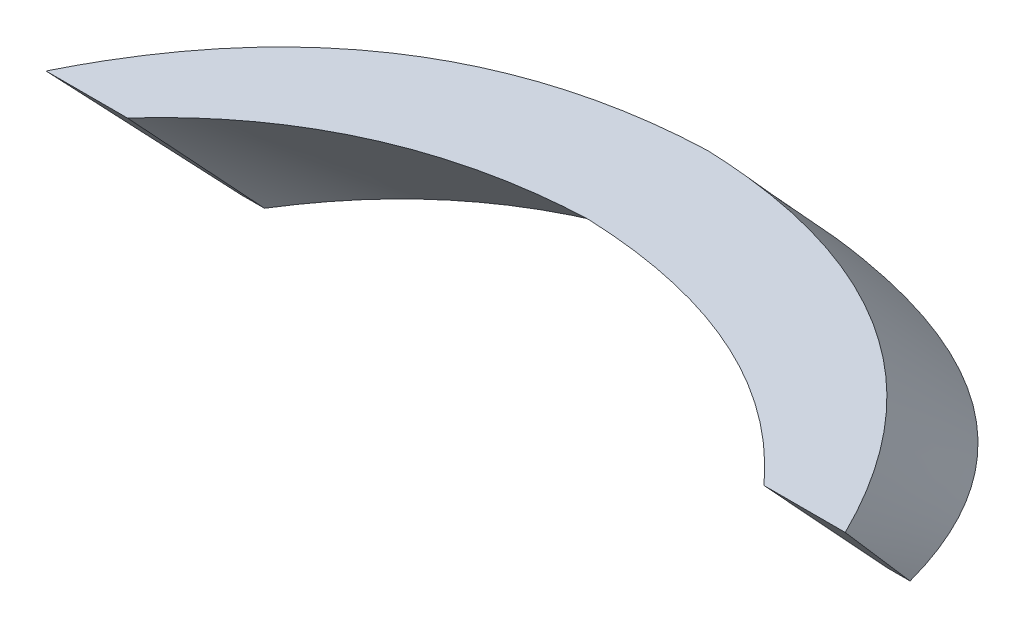
ISO-10303-21;
HEADER;
FILE_DESCRIPTION(('STEP AP214'),'2;1');
FILE_NAME('part.step','',(''),(''),'','','');
FILE_SCHEMA(('AUTOMOTIVE_DESIGN { 1 0 10303 214 1 1 1 1 }'));
ENDSEC;
DATA;
#1=APPLICATION_CONTEXT('core data for automotive mechanical design processes');
#2=APPLICATION_PROTOCOL_DEFINITION('international standard','automotive_design',2000,#1);
#3=PRODUCT_CONTEXT('',#1,'mechanical');
#4=PRODUCT('Part','Part','',(#3));
#5=PRODUCT_RELATED_PRODUCT_CATEGORY('part','',(#4));
#6=PRODUCT_DEFINITION_FORMATION('','',#4);
#7=PRODUCT_DEFINITION_CONTEXT('part definition',#1,'design');
#8=PRODUCT_DEFINITION('design','',#6,#7);
#9=PRODUCT_DEFINITION_SHAPE('','',#8);
#10=(LENGTH_UNIT() NAMED_UNIT(*) SI_UNIT(.MILLI.,.METRE.));
#11=(NAMED_UNIT(*) PLANE_ANGLE_UNIT() SI_UNIT($,.RADIAN.));
#12=(NAMED_UNIT(*) SI_UNIT($,.STERADIAN.) SOLID_ANGLE_UNIT());
#13=UNCERTAINTY_MEASURE_WITH_UNIT(LENGTH_MEASURE(1.E-05),#10,'distance_accuracy_value','');
#14=(GEOMETRIC_REPRESENTATION_CONTEXT(3) GLOBAL_UNCERTAINTY_ASSIGNED_CONTEXT((#13)) GLOBAL_UNIT_ASSIGNED_CONTEXT((#10,
#11,#12)) REPRESENTATION_CONTEXT('',''));
#15=CARTESIAN_POINT('',(0.,0.,0.));
#16=DIRECTION('',(0.,0.,1.));
#17=DIRECTION('',(1.,0.,0.));
#18=AXIS2_PLACEMENT_3D('',#15,#16,#17);
#19=CARTESIAN_POINT('',(-952.908610028907,1447.99219123021,-15137.4741638274));
#20=DIRECTION('',(0.,1.,0.));
#21=DIRECTION('',(0.,0.,1.));
#22=AXIS2_PLACEMENT_3D('',#19,#20,#21);
#23=PLANE('',#22);
#24=CARTESIAN_POINT('',(0.,1447.99219123021,-15488.7066288827));
#25=CARTESIAN_POINT('',(-1182.13002672557,1447.99219123021,-15348.8535160101));
#26=CARTESIAN_POINT('',(-1447.37438666448,1447.99219123021,-14363.4829944068));
#27=B_SPLINE_CURVE_WITH_KNOTS('',2,(#24,#25,#26),.UNSPECIFIED.,.F.,.F.,(3,3),(0.,1.),.UNSPECIFIED.);
#28=CARTESIAN_POINT('',(0.,1447.99219123021,-15488.7066288827));
#29=VERTEX_POINT('',#28);
#30=CARTESIAN_POINT('',(-1447.37438666448,1447.99219123021,-14363.4829944068));
#31=VERTEX_POINT('',#30);
#32=EDGE_CURVE('E563',#29,#31,#27,.T.);
#33=ORIENTED_EDGE('',*,*,#32,.F.);
#34=CARTESIAN_POINT('',(1447.37438666448,1447.99219123021,-14363.4829944068));
#35=CARTESIAN_POINT('',(1182.13002672557,1447.99219123021,-15348.8535160101));
#36=CARTESIAN_POINT('',(0.,1447.99219123021,-15488.7066288827));
#37=B_SPLINE_CURVE_WITH_KNOTS('',2,(#34,#35,#36),.UNSPECIFIED.,.F.,.F.,(3,3),(0.,1.),.UNSPECIFIED.);
#38=CARTESIAN_POINT('',(1447.37438666448,1447.99219123021,-14363.4829944068));
#39=VERTEX_POINT('',#38);
#40=EDGE_CURVE('E553',#39,#29,#37,.T.);
#41=ORIENTED_EDGE('',*,*,#40,.F.);
#42=DIRECTION('',(1.,0.,0.));
#43=VECTOR('',#42,1.);
#44=CARTESIAN_POINT('',(1447.37438666448,1447.99219123021,-14363.4829944068));
#45=LINE('',#44,#43);
#46=CARTESIAN_POINT('',(1346.84741369142,1447.99219123021,-14363.4829944068));
#47=VERTEX_POINT('',#46);
#48=EDGE_CURVE('E543',#47,#39,#45,.T.);
#49=ORIENTED_EDGE('',*,*,#48,.F.);
#50=CARTESIAN_POINT('',(0.,1447.99219123021,-15180.0888616126));
#51=CARTESIAN_POINT('',(892.254112882625,1447.99219123021,-15093.5273384483));
#52=CARTESIAN_POINT('',(1346.84741369142,1447.99219123021,-14363.4829944068));
#53=B_SPLINE_CURVE_WITH_KNOTS('',2,(#50,#51,#52),.UNSPECIFIED.,.F.,.F.,(3,3),(0.,1.),.UNSPECIFIED.);
#54=CARTESIAN_POINT('',(0.,1447.99219123021,-15180.0888616126));
#55=VERTEX_POINT('',#54);
#56=EDGE_CURVE('E436',#55,#47,#53,.T.);
#57=ORIENTED_EDGE('',*,*,#56,.F.);
#58=CARTESIAN_POINT('',(-1346.84741369142,1447.99219123021,-14363.4829944068));
#59=CARTESIAN_POINT('',(-892.254112882625,1447.99219123021,-15093.5273384483));
#60=CARTESIAN_POINT('',(0.,1447.99219123021,-15180.0888616126));
#61=B_SPLINE_CURVE_WITH_KNOTS('',2,(#58,#59,#60),.UNSPECIFIED.,.F.,.F.,(3,3),(0.,1.),.UNSPECIFIED.);
#62=CARTESIAN_POINT('',(-1346.84741369142,1447.99219123021,-14363.4829944068));
#63=VERTEX_POINT('',#62);
#64=EDGE_CURVE('E382',#63,#55,#61,.T.);
#65=ORIENTED_EDGE('',*,*,#64,.F.);
#66=DIRECTION('',(1.,0.,0.));
#67=VECTOR('',#66,1.);
#68=CARTESIAN_POINT('',(-1447.37438666448,1447.99219123021,-14363.4829944068));
#69=LINE('',#68,#67);
#70=EDGE_CURVE('E12',#31,#63,#69,.T.);
#71=ORIENTED_EDGE('',*,*,#70,.F.);
#72=EDGE_LOOP('',(#33,#41,#49,#57,#65,#71));
#73=FACE_BOUND('',#72,.T.);
#74=ADVANCED_FACE('F371',(#73),#23,.F.);
#75=CARTESIAN_POINT('',(1029.20869043457,2052.62960614324,-14629.3807596282));
#76=DIRECTION('',(0.,-1.,0.));
#77=DIRECTION('',(0.,0.,-1.));
#78=AXIS2_PLACEMENT_3D('',#75,#76,#77);
#79=PLANE('',#78);
#80=CARTESIAN_POINT('',(1729.62097170329,2052.62960614324,-13800.6828504846));
#81=CARTESIAN_POINT('',(1193.60689501749,2052.62960614324,-14891.1922002363));
#82=CARTESIAN_POINT('',(0.,2052.62960614324,-14934.4557875557));
#83=B_SPLINE_CURVE_WITH_KNOTS('',2,(#80,#81,#82),.UNSPECIFIED.,.F.,.F.,(3,3),(0.,1.),.UNSPECIFIED.);
#84=CARTESIAN_POINT('',(1729.62097170329,2052.62960614324,-13800.6828504846));
#85=VERTEX_POINT('',#84);
#86=CARTESIAN_POINT('',(0.,2052.62960614324,-14934.4557875557));
#87=VERTEX_POINT('',#86);
#88=EDGE_CURVE('E506',#85,#87,#83,.T.);
#89=ORIENTED_EDGE('',*,*,#88,.T.);
#90=CARTESIAN_POINT('',(0.,2052.62960614324,-14934.4557875557));
#91=CARTESIAN_POINT('',(-1193.60689501749,2052.62960614324,-14891.1922002363));
#92=CARTESIAN_POINT('',(-1729.62097170329,2052.62960614324,-13800.6828504846));
#93=B_SPLINE_CURVE_WITH_KNOTS('',2,(#90,#91,#92),.UNSPECIFIED.,.F.,.F.,(3,3),(0.,1.),.UNSPECIFIED.);
#94=CARTESIAN_POINT('',(-1729.62097170329,2052.62960614324,-13800.6828504846));
#95=VERTEX_POINT('',#94);
#96=EDGE_CURVE('E629',#87,#95,#93,.T.);
#97=ORIENTED_EDGE('',*,*,#96,.T.);
#98=DIRECTION('',(1.,0.,0.));
#99=VECTOR('',#98,1.);
#100=CARTESIAN_POINT('',(-1729.62097170329,2052.62960614324,-13800.6828504846));
#101=LINE('',#100,#99);
#102=CARTESIAN_POINT('',(-1377.14288614841,2052.62960614324,-13800.6828504846));
#103=VERTEX_POINT('',#102);
#104=EDGE_CURVE('E620',#95,#103,#101,.T.);
#105=ORIENTED_EDGE('',*,*,#104,.T.);
#106=CARTESIAN_POINT('',(-1377.14288614841,2052.62960614324,-13800.6828504846));
#107=CARTESIAN_POINT('',(-850.648259402485,2052.62960614324,-14385.325069701));
#108=CARTESIAN_POINT('',(0.,2052.62960614324,-14418.383322118));
#109=B_SPLINE_CURVE_WITH_KNOTS('',2,(#106,#107,#108),.UNSPECIFIED.,.F.,.F.,(3,3),(0.,1.),.UNSPECIFIED.);
#110=CARTESIAN_POINT('',(0.,2052.62960614324,-14418.383322118));
#111=VERTEX_POINT('',#110);
#112=EDGE_CURVE('E459',#103,#111,#109,.T.);
#113=ORIENTED_EDGE('',*,*,#112,.T.);
#114=CARTESIAN_POINT('',(0.,2052.62960614324,-14418.383322118));
#115=CARTESIAN_POINT('',(850.648259402485,2052.62960614324,-14385.325069701));
#116=CARTESIAN_POINT('',(1377.14288614841,2052.62960614324,-13800.6828504846));
#117=B_SPLINE_CURVE_WITH_KNOTS('',2,(#114,#115,#116),.UNSPECIFIED.,.F.,.F.,(3,3),(0.,1.),.UNSPECIFIED.);
#118=CARTESIAN_POINT('',(1377.14288614841,2052.62960614324,-13800.6828504846));
#119=VERTEX_POINT('',#118);
#120=EDGE_CURVE('E432',#111,#119,#117,.T.);
#121=ORIENTED_EDGE('',*,*,#120,.T.);
#122=DIRECTION('',(1.,0.,0.));
#123=VECTOR('',#122,1.);
#124=CARTESIAN_POINT('',(1729.62097170329,2052.62960614324,-13800.6828504846));
#125=LINE('',#124,#123);
#126=EDGE_CURVE('E444',#119,#85,#125,.T.);
#127=ORIENTED_EDGE('',*,*,#126,.T.);
#128=EDGE_LOOP('',(#89,#97,#105,#113,#121,#127));
#129=FACE_BOUND('',#128,.T.);
#130=ADVANCED_FACE('F457',(#129),#79,.F.);
#131=CARTESIAN_POINT('',(0.,2052.62960614324,-14934.4557875557));
#132=CARTESIAN_POINT('',(0.,1447.99219123021,-15488.7066288827));
#133=CARTESIAN_POINT('',(1193.60689501749,2052.62960614324,-14891.1922002363));
#134=CARTESIAN_POINT('',(1182.13002672557,1447.99219123021,-15348.8535160101));
#135=CARTESIAN_POINT('',(1729.62097170329,2052.62960614324,-13800.6828504846));
#136=CARTESIAN_POINT('',(1447.37438666448,1447.99219123021,-14363.4829944068));
#137=B_SPLINE_SURFACE_WITH_KNOTS('',2,1,((#131,#132),(#133,#134),(#135,#136)),.UNSPECIFIED.,.F.,
.F.,.F.,(3,3),(2,2),(0.,1.),(0.,1.),.UNSPECIFIED.);
#138=DIRECTION('',(-0.323335247921954,-0.692658826773445,-0.644731003709363));
#139=VECTOR('',#138,1.);
#140=CARTESIAN_POINT('',(1588.49767918388,1750.31089868673,-14082.0829224457));
#141=LINE('',#140,#139);
#142=EDGE_CURVE('E441',#85,#39,#141,.T.);
#143=DIRECTION('',(0.,0.737154214497795,0.675724547466007));
#144=VECTOR('',#143,1.);
#145=CARTESIAN_POINT('',(0.,1750.31089868673,-15211.5812082192));
#146=LINE('',#145,#144);
#147=EDGE_CURVE('E452',#29,#87,#146,.T.);
#148=ORIENTED_EDGE('',*,*,#88,.F.);
#149=ORIENTED_EDGE('',*,*,#142,.T.);
#150=ORIENTED_EDGE('',*,*,#40,.T.);
#151=ORIENTED_EDGE('',*,*,#147,.T.);
#152=EDGE_LOOP('',(#148,#149,#150,#151));
#153=FACE_BOUND('',#152,.T.);
#154=ADVANCED_FACE('F478',(#153),#137,.T.);
#155=CARTESIAN_POINT('',(0.,7835.48962956916,-8417.96194504));
#156=DIRECTION('',(0.,-0.68132894198889,0.731977371787066));
#157=DIRECTION('',(0.,-0.731977371787066,-0.68132894198889));
#158=AXIS2_PLACEMENT_3D('',#155,#156,#157);
#159=PLANE('',#158);
#160=DIRECTION('',(-0.0366512233238058,-0.731485569514311,-0.68087116947422));
#161=VECTOR('',#160,1.);
#162=CARTESIAN_POINT('',(1377.14288614841,2052.62960614324,-13800.6828504846));
#163=LINE('',#162,#161);
#164=EDGE_CURVE('E427',#119,#47,#163,.T.);
#165=ORIENTED_EDGE('',*,*,#164,.T.);
#166=ORIENTED_EDGE('',*,*,#48,.T.);
#167=ORIENTED_EDGE('',*,*,#142,.F.);
#168=ORIENTED_EDGE('',*,*,#126,.F.);
#169=EDGE_LOOP('',(#165,#166,#167,#168));
#170=FACE_BOUND('',#169,.T.);
#171=ADVANCED_FACE('F446',(#170),#159,.T.);
#172=CARTESIAN_POINT('',(-1729.62097170329,2052.62960614324,-13800.6828504846));
#173=CARTESIAN_POINT('',(-1447.37438666448,1447.99219123021,-14363.4829944068));
#174=CARTESIAN_POINT('',(-1193.60689501749,2052.62960614324,-14891.1922002363));
#175=CARTESIAN_POINT('',(-1182.13002672557,1447.99219123021,-15348.8535160101));
#176=CARTESIAN_POINT('',(0.,2052.62960614324,-14934.4557875557));
#177=CARTESIAN_POINT('',(0.,1447.99219123021,-15488.7066288827));
#178=B_SPLINE_SURFACE_WITH_KNOTS('',2,1,((#172,#173),(#174,#175),(#176,#177)),.UNSPECIFIED.,.F.,
.F.,.F.,(3,3),(2,2),(0.,1.),(0.,1.),.UNSPECIFIED.);
#179=DIRECTION('',(0.323335247921954,-0.692658826773445,-0.644731003709363));
#180=VECTOR('',#179,1.);
#181=CARTESIAN_POINT('',(-1729.62097170329,2052.62960614324,-13800.6828504846));
#182=LINE('',#181,#180);
#183=EDGE_CURVE('E602',#95,#31,#182,.T.);
#184=ORIENTED_EDGE('',*,*,#96,.F.);
#185=ORIENTED_EDGE('',*,*,#147,.F.);
#186=ORIENTED_EDGE('',*,*,#32,.T.);
#187=ORIENTED_EDGE('',*,*,#183,.F.);
#188=EDGE_LOOP('',(#184,#185,#186,#187));
#189=FACE_BOUND('',#188,.T.);
#190=ADVANCED_FACE('F644',(#189),#178,.T.);
#191=CARTESIAN_POINT('',(1377.14288614841,2052.62960614324,-13800.6828504846));
#192=CARTESIAN_POINT('',(1346.84741369142,1447.99219123021,-14363.4829944068));
#193=CARTESIAN_POINT('',(850.648259402485,2052.62960614324,-14385.325069701));
#194=CARTESIAN_POINT('',(892.254112882625,1447.99219123021,-15093.5273384483));
#195=CARTESIAN_POINT('',(0.,2052.62960614324,-14418.383322118));
#196=CARTESIAN_POINT('',(0.,1447.99219123021,-15180.0888616126));
#197=B_SPLINE_SURFACE_WITH_KNOTS('',2,1,((#191,#192),(#193,#194),(#195,#196)),.UNSPECIFIED.,.F.,
.F.,.F.,(3,3),(2,2),(0.,1.),(0.,1.),.UNSPECIFIED.);
#198=DIRECTION('',(0.,-0.621726755184929,-0.783234219047674));
#199=VECTOR('',#198,1.);
#200=CARTESIAN_POINT('',(0.,1750.31089868673,-14799.2360918653));
#201=LINE('',#200,#199);
#202=EDGE_CURVE('E440',#111,#55,#201,.T.);
#203=ORIENTED_EDGE('',*,*,#120,.F.);
#204=ORIENTED_EDGE('',*,*,#202,.T.);
#205=ORIENTED_EDGE('',*,*,#56,.T.);
#206=ORIENTED_EDGE('',*,*,#164,.F.);
#207=EDGE_LOOP('',(#203,#204,#205,#206));
#208=FACE_BOUND('',#207,.T.);
#209=ADVANCED_FACE('F429',(#208),#197,.T.);
#210=CARTESIAN_POINT('',(0.,2052.62960614324,-14418.383322118));
#211=CARTESIAN_POINT('',(0.,1447.99219123021,-15180.0888616126));
#212=CARTESIAN_POINT('',(-850.648259402485,2052.62960614324,-14385.325069701));
#213=CARTESIAN_POINT('',(-892.254112882625,1447.99219123021,-15093.5273384483));
#214=CARTESIAN_POINT('',(-1377.14288614841,2052.62960614324,-13800.6828504846));
#215=CARTESIAN_POINT('',(-1346.84741369142,1447.99219123021,-14363.4829944068));
#216=B_SPLINE_SURFACE_WITH_KNOTS('',2,1,((#210,#211),(#212,#213),(#214,#215)),.UNSPECIFIED.,.F.,
.F.,.F.,(3,3),(2,2),(0.,1.),(0.,1.),.UNSPECIFIED.);
#217=DIRECTION('',(0.0366512233238058,-0.731485569514311,-0.68087116947422));
#218=VECTOR('',#217,1.);
#219=CARTESIAN_POINT('',(-1361.99514991991,1750.31089868673,-14082.0829224457));
#220=LINE('',#219,#218);
#221=EDGE_CURVE('E390',#103,#63,#220,.T.);
#222=ORIENTED_EDGE('',*,*,#112,.F.);
#223=ORIENTED_EDGE('',*,*,#221,.T.);
#224=ORIENTED_EDGE('',*,*,#64,.T.);
#225=ORIENTED_EDGE('',*,*,#202,.F.);
#226=EDGE_LOOP('',(#222,#223,#224,#225));
#227=FACE_BOUND('',#226,.T.);
#228=ADVANCED_FACE('F682',(#227),#216,.T.);
#229=CARTESIAN_POINT('',(0.,7835.48962956915,-8417.96194504));
#230=DIRECTION('',(0.,-0.681328941988889,0.731977371787066));
#231=DIRECTION('',(0.,-0.731977371787066,-0.68132894198889));
#232=AXIS2_PLACEMENT_3D('',#229,#230,#231);
#233=PLANE('',#232);
#234=ORIENTED_EDGE('',*,*,#183,.T.);
#235=ORIENTED_EDGE('',*,*,#70,.T.);
#236=ORIENTED_EDGE('',*,*,#221,.F.);
#237=ORIENTED_EDGE('',*,*,#104,.F.);
#238=EDGE_LOOP('',(#234,#235,#236,#237));
#239=FACE_BOUND('',#238,.T.);
#240=ADVANCED_FACE('F673',(#239),#233,.T.);
#241=CLOSED_SHELL('',(#74,#130,#154,#171,#190,#209,#228,#240));
#242=MANIFOLD_SOLID_BREP('B2',#241);
#243=ADVANCED_BREP_SHAPE_REPRESENTATION('',(#18,#242),#14);
#244=SHAPE_DEFINITION_REPRESENTATION(#9,#243);
ENDSEC;
END-ISO-10303-21;
